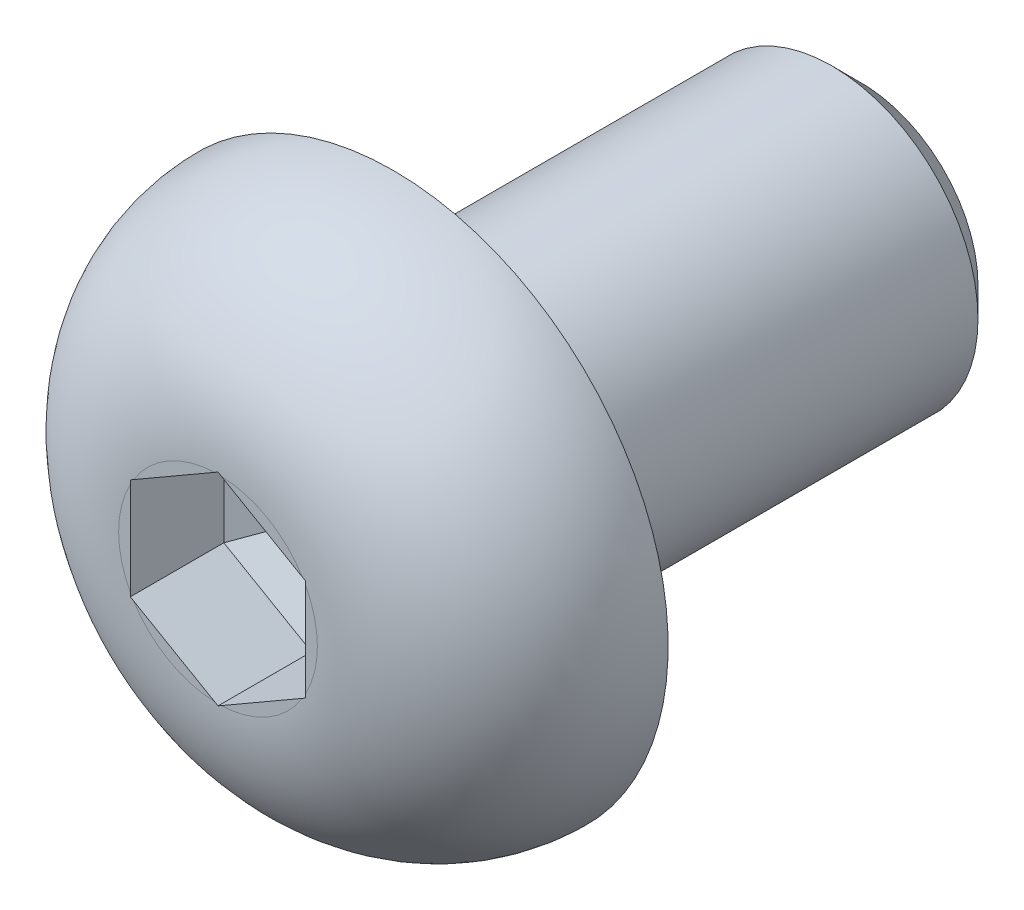
ISO-10303-21;
HEADER;
FILE_DESCRIPTION(('STEP AP214'),'2;1');
FILE_NAME('part.step','',(''),(''),'','','');
FILE_SCHEMA(('AUTOMOTIVE_DESIGN { 1 0 10303 214 1 1 1 1 }'));
ENDSEC;
DATA;
#1=APPLICATION_CONTEXT('core data for automotive mechanical design processes');
#2=APPLICATION_PROTOCOL_DEFINITION('international standard','automotive_design',2000,#1);
#3=PRODUCT_CONTEXT('',#1,'mechanical');
#4=PRODUCT('Part','Part','',(#3));
#5=PRODUCT_RELATED_PRODUCT_CATEGORY('part','',(#4));
#6=PRODUCT_DEFINITION_FORMATION('','',#4);
#7=PRODUCT_DEFINITION_CONTEXT('part definition',#1,'design');
#8=PRODUCT_DEFINITION('design','',#6,#7);
#9=PRODUCT_DEFINITION_SHAPE('','',#8);
#10=(LENGTH_UNIT() NAMED_UNIT(*) SI_UNIT(.MILLI.,.METRE.));
#11=(NAMED_UNIT(*) PLANE_ANGLE_UNIT() SI_UNIT($,.RADIAN.));
#12=(NAMED_UNIT(*) SI_UNIT($,.STERADIAN.) SOLID_ANGLE_UNIT());
#13=UNCERTAINTY_MEASURE_WITH_UNIT(LENGTH_MEASURE(1.E-05),#10,'distance_accuracy_value','');
#14=(GEOMETRIC_REPRESENTATION_CONTEXT(3) GLOBAL_UNCERTAINTY_ASSIGNED_CONTEXT((#13)) GLOBAL_UNIT_ASSIGNED_CONTEXT((#10,
#11,#12)) REPRESENTATION_CONTEXT('',''));
#15=CARTESIAN_POINT('',(0.,0.,0.));
#16=DIRECTION('',(0.,0.,1.));
#17=DIRECTION('',(1.,0.,0.));
#18=AXIS2_PLACEMENT_3D('',#15,#16,#17);
#19=CARTESIAN_POINT('',(0.,0.,2.));
#20=DIRECTION('',(0.,0.,1.));
#21=DIRECTION('',(1.,0.,0.));
#22=AXIS2_PLACEMENT_3D('',#19,#20,#21);
#23=PLANE('',#22);
#24=CARTESIAN_POINT('',(0.,0.,2.));
#25=DIRECTION('',(0.,0.,1.));
#26=DIRECTION('',(1.,0.,0.));
#27=AXIS2_PLACEMENT_3D('',#24,#25,#26);
#28=CIRCLE('',#27,1.00000019703);
#29=CARTESIAN_POINT('',(1.00000019703,0.,2.));
#30=VERTEX_POINT('',#29);
#31=EDGE_CURVE('E11',#30,#30,#28,.T.);
#32=ORIENTED_EDGE('',*,*,#31,.F.);
#33=EDGE_LOOP('',(#32));
#34=FACE_BOUND('',#33,.T.);
#35=ADVANCED_FACE('F17',(#34),#23,.F.);
#36=CARTESIAN_POINT('',(0.,0.,2.124999789005));
#37=DIRECTION('',(0.,0.,1.));
#38=DIRECTION('',(0.,-1.,0.));
#39=AXIS2_PLACEMENT_3D('',#36,#37,#38);
#40=CONICAL_SURFACE('',#39,1.125000010663,0.785398261912409);
#41=ORIENTED_EDGE('',*,*,#31,.T.);
#42=EDGE_LOOP('',(#41));
#43=FACE_BOUND('',#42,.T.);
#44=CARTESIAN_POINT('',(0.,0.,2.249999753713));
#45=DIRECTION('',(0.,0.,-1.));
#46=DIRECTION('',(1.,0.,0.));
#47=AXIS2_PLACEMENT_3D('',#44,#45,#46);
#48=CIRCLE('',#47,1.25);
#49=CARTESIAN_POINT('',(1.25,0.,2.249999753713));
#50=VERTEX_POINT('',#49);
#51=EDGE_CURVE('E315',#50,#50,#48,.T.);
#52=ORIENTED_EDGE('',*,*,#51,.T.);
#53=EDGE_LOOP('',(#52));
#54=FACE_BOUND('',#53,.T.);
#55=ADVANCED_FACE('F343',(#43,#54),#40,.T.);
#56=CARTESIAN_POINT('',(0.,0.,7.5));
#57=DIRECTION('',(0.,0.,-1.));
#58=DIRECTION('',(0.,-1.,0.));
#59=AXIS2_PLACEMENT_3D('',#56,#57,#58);
#60=PLANE('',#59);
#61=CARTESIAN_POINT('',(0.,0.,7.499999999987));
#62=DIRECTION('',(0.,0.,-1.));
#63=DIRECTION('',(0.848717837075013,-0.528845944515708,0.));
#64=AXIS2_PLACEMENT_3D('',#61,#62,#63);
#65=CIRCLE('',#64,0.8499937568999);
#66=CARTESIAN_POINT('',(0.7214095809729,-0.4495192983039,7.5));
#67=VERTEX_POINT('',#66);
#68=CARTESIAN_POINT('',(0.02859309510343,-0.8495197335029,7.5));
#69=VERTEX_POINT('',#68);
#70=EDGE_CURVE('E279',#67,#69,#65,.T.);
#71=ORIENTED_EDGE('',*,*,#70,.F.);
#72=DIRECTION('',(0.86602396910502,0.500002484929412,6.10625033893714E-13));
#73=VECTOR('',#72,1.);
#74=CARTESIAN_POINT('',(0.02859309510343,-0.8495197335029,7.5));
#75=LINE('',#74,#73);
#76=EDGE_CURVE('E269',#69,#67,#75,.T.);
#77=ORIENTED_EDGE('',*,*,#76,.F.);
#78=EDGE_LOOP('',(#71,#77));
#79=FACE_BOUND('',#78,.T.);
#80=ADVANCED_FACE('F412',(#79),#60,.F.);
#81=CARTESIAN_POINT('',(0.,0.,7.5));
#82=DIRECTION('',(0.,0.,-1.));
#83=DIRECTION('',(0.,-1.,0.));
#84=AXIS2_PLACEMENT_3D('',#81,#82,#83);
#85=PLANE('',#84);
#86=CARTESIAN_POINT('',(0.,0.,7.499999999987));
#87=DIRECTION('',(0.,0.,-1.));
#88=DIRECTION('',(-0.0336351041015099,-0.999434179809797,0.));
#89=AXIS2_PLACEMENT_3D('',#86,#87,#88);
#90=CIRCLE('',#89,0.8499937568997);
#91=CARTESIAN_POINT('',(-0.02859309510341,-0.849519733503,7.499999999999));
#92=VERTEX_POINT('',#91);
#93=CARTESIAN_POINT('',(-0.7214095809727,-0.4495192983038,7.5));
#94=VERTEX_POINT('',#93);
#95=EDGE_CURVE('E254',#92,#94,#90,.T.);
#96=ORIENTED_EDGE('',*,*,#95,.F.);
#97=DIRECTION('',(0.866023969104909,-0.500002484929605,-6.31719353246506E-13));
#98=VECTOR('',#97,1.);
#99=CARTESIAN_POINT('',(-0.7214095809727,-0.4495192983038,7.5));
#100=LINE('',#99,#98);
#101=EDGE_CURVE('E259',#94,#92,#100,.T.);
#102=ORIENTED_EDGE('',*,*,#101,.F.);
#103=EDGE_LOOP('',(#96,#102));
#104=FACE_BOUND('',#103,.T.);
#105=ADVANCED_FACE('F519',(#104),#85,.F.);
#106=CARTESIAN_POINT('',(0.,0.,7.5));
#107=DIRECTION('',(0.,0.,-1.));
#108=DIRECTION('',(0.,-1.,0.));
#109=AXIS2_PLACEMENT_3D('',#106,#107,#108);
#110=PLANE('',#109);
#111=CARTESIAN_POINT('',(0.,0.,7.499999999987));
#112=DIRECTION('',(0.,0.,-1.));
#113=DIRECTION('',(-0.848717837075013,0.528845944515708,0.));
#114=AXIS2_PLACEMENT_3D('',#111,#112,#113);
#115=CIRCLE('',#114,0.8499937568999);
#116=CARTESIAN_POINT('',(-0.721409580973,0.4495192983038,7.5));
#117=VERTEX_POINT('',#116);
#118=CARTESIAN_POINT('',(-0.02859309510337,0.8495197335029,7.5));
#119=VERTEX_POINT('',#118);
#120=EDGE_CURVE('E224',#117,#119,#115,.T.);
#121=ORIENTED_EDGE('',*,*,#120,.F.);
#122=DIRECTION('',(-0.86602396910502,-0.500002484929412,6.10625033893614E-13));
#123=VECTOR('',#122,1.);
#124=CARTESIAN_POINT('',(-0.02859309510337,0.8495197335029,7.5));
#125=LINE('',#124,#123);
#126=EDGE_CURVE('E217',#119,#117,#125,.T.);
#127=ORIENTED_EDGE('',*,*,#126,.F.);
#128=EDGE_LOOP('',(#121,#127));
#129=FACE_BOUND('',#128,.T.);
#130=ADVANCED_FACE('F491',(#129),#110,.F.);
#131=CARTESIAN_POINT('',(0.,0.,7.5));
#132=DIRECTION('',(0.,0.,-1.));
#133=DIRECTION('',(0.,-1.,0.));
#134=AXIS2_PLACEMENT_3D('',#131,#132,#133);
#135=PLANE('',#134);
#136=CARTESIAN_POINT('',(0.,0.,7.499999999995));
#137=DIRECTION('',(0.,0.,-1.));
#138=DIRECTION('',(0.882352941176484,0.470588235294092,0.));
#139=AXIS2_PLACEMENT_3D('',#136,#137,#138);
#140=CIRCLE('',#139,0.8500038733679);
#141=CARTESIAN_POINT('',(0.74999840261235,0.400005026801156,7.49999999999049));
#142=VERTEX_POINT('',#141);
#143=CARTESIAN_POINT('',(0.749998738069626,-0.400003325957899,7.49999999999138));
#144=VERTEX_POINT('',#143);
#145=EDGE_CURVE('E292',#142,#144,#140,.T.);
#146=ORIENTED_EDGE('',*,*,#145,.F.);
#147=DIRECTION('',(0.,-1.,0.));
#148=VECTOR('',#147,1.);
#149=CARTESIAN_POINT('',(0.7499968052247,0.39999806325,7.499999999986));
#150=LINE('',#149,#148);
#151=EDGE_CURVE('E93',#142,#144,#150,.T.);
#152=ORIENTED_EDGE('',*,*,#151,.T.);
#153=EDGE_LOOP('',(#146,#152));
#154=FACE_BOUND('',#153,.T.);
#155=ADVANCED_FACE('F484',(#154),#135,.F.);
#156=CARTESIAN_POINT('',(0.,0.,7.5));
#157=DIRECTION('',(0.,0.,-1.));
#158=DIRECTION('',(0.,-1.,0.));
#159=AXIS2_PLACEMENT_3D('',#156,#157,#158);
#160=PLANE('',#159);
#161=CARTESIAN_POINT('',(0.,0.,7.499999999995));
#162=DIRECTION('',(0.,0.,-1.));
#163=DIRECTION('',(-0.882352941176484,-0.470588235294092,0.));
#164=AXIS2_PLACEMENT_3D('',#161,#162,#163);
#165=CIRCLE('',#164,0.8500038733679);
#166=CARTESIAN_POINT('',(-0.74999840261235,-0.400005026801156,7.49999999999049));
#167=VERTEX_POINT('',#166);
#168=CARTESIAN_POINT('',(-0.749998738069626,0.400003325957899,7.49999999999138));
#169=VERTEX_POINT('',#168);
#170=EDGE_CURVE('E236',#167,#169,#165,.T.);
#171=ORIENTED_EDGE('',*,*,#170,.F.);
#172=DIRECTION('',(0.,1.,0.));
#173=VECTOR('',#172,1.);
#174=CARTESIAN_POINT('',(-0.7499968052247,-0.39999806325,7.499999999986));
#175=LINE('',#174,#173);
#176=EDGE_CURVE('E34',#167,#169,#175,.T.);
#177=ORIENTED_EDGE('',*,*,#176,.T.);
#178=EDGE_LOOP('',(#171,#177));
#179=FACE_BOUND('',#178,.T.);
#180=ADVANCED_FACE('F482',(#179),#160,.F.);
#181=CARTESIAN_POINT('',(-0.75,0.4330127018922,7.5));
#182=DIRECTION('',(-1.,0.,0.));
#183=DIRECTION('',(0.,0.,1.));
#184=AXIS2_PLACEMENT_3D('',#181,#182,#183);
#185=PLANE('',#184);
#186=DIRECTION('',(2.24992903633302E-06,-5.67352059675705E-07,0.999999999997308));
#187=VECTOR('',#186,1.);
#188=CARTESIAN_POINT('',(-0.75,0.4330127018922,6.7));
#189=LINE('',#188,#187);
#190=CARTESIAN_POINT('',(-0.75,0.4330127018922,6.7));
#191=VERTEX_POINT('',#190);
#192=CARTESIAN_POINT('',(-0.749998523448235,0.43301280791993,7.49991440612962));
#193=VERTEX_POINT('',#192);
#194=EDGE_CURVE('E220',#191,#193,#189,.T.);
#195=ORIENTED_EDGE('',*,*,#194,.T.);
#196=CARTESIAN_POINT('',(-0.75,0.433012247970175,7.49991439546112));
#197=CARTESIAN_POINT('',(-0.75,0.42750992025355,7.49994336110495));
#198=CARTESIAN_POINT('',(-0.75,0.422007573480964,7.49996497763848));
#199=CARTESIAN_POINT('',(-0.75,0.411002842395928,7.49999351248346));
#200=CARTESIAN_POINT('',(-0.75,0.405500458083482,7.50000043079644));
#201=CARTESIAN_POINT('',(-0.75,0.39999805471508,7.50000000000065));
#202=B_SPLINE_CURVE_WITH_KNOTS('',3,(#196,#197,#198,#199,#200,#201),.UNSPECIFIED.,.F.,.F.,(4,2,
4),(0.,0.0165071677014205,0.0330143336866557),.UNSPECIFIED.);
#203=EDGE_CURVE('E240',#193,#169,#202,.T.);
#204=ORIENTED_EDGE('',*,*,#203,.T.);
#205=ORIENTED_EDGE('',*,*,#176,.F.);
#206=CARTESIAN_POINT('',(-0.75,-0.4000018227614,7.50000000000199));
#207=CARTESIAN_POINT('',(-0.75,-0.405503598118224,7.50000042758911));
#208=CARTESIAN_POINT('',(-0.75,-0.411005354421076,7.49999350767165));
#209=CARTESIAN_POINT('',(-0.75,-0.422008829490639,7.49996497282612));
#210=CARTESIAN_POINT('',(-0.75,-0.427510548257345,7.49994335789651));
#211=CARTESIAN_POINT('',(-0.75,-0.433012247970075,7.4999143954608));
#212=B_SPLINE_CURVE_WITH_KNOTS('',3,(#206,#207,#208,#209,#210,#211),.UNSPECIFIED.,.F.,.F.,(4,2,
4),(0.,0.0165052819639968,0.0330105656434137),.UNSPECIFIED.);
#213=CARTESIAN_POINT('',(-0.749999423323558,-0.433012807875431,7.49991439780553));
#214=VERTEX_POINT('',#213);
#215=EDGE_CURVE('E241',#167,#214,#212,.T.);
#216=ORIENTED_EDGE('',*,*,#215,.T.);
#217=DIRECTION('',(2.24992919913702E-06,5.67352198329605E-07,0.999999999997308));
#218=VECTOR('',#217,1.);
#219=CARTESIAN_POINT('',(-0.75,-0.4330127018922,6.7));
#220=LINE('',#219,#218);
#221=CARTESIAN_POINT('',(-0.75,-0.4330127018922,6.7));
#222=VERTEX_POINT('',#221);
#223=EDGE_CURVE('E242',#222,#214,#220,.T.);
#224=ORIENTED_EDGE('',*,*,#223,.F.);
#225=DIRECTION('',(0.,1.,0.));
#226=VECTOR('',#225,1.);
#227=CARTESIAN_POINT('',(-0.75,-0.4330127018922,6.7));
#228=LINE('',#227,#226);
#229=EDGE_CURVE('E215',#222,#191,#228,.T.);
#230=ORIENTED_EDGE('',*,*,#229,.T.);
#231=EDGE_LOOP('',(#195,#204,#205,#216,#224,#230));
#232=FACE_BOUND('',#231,.T.);
#233=ADVANCED_FACE('F476',(#232),#185,.F.);
#234=CARTESIAN_POINT('',(-0.3966506350946,0.,6.5));
#235=DIRECTION('',(-0.492581293369386,0.,-0.870266435881876));
#236=DIRECTION('',(-0.870266435881876,0.,0.492581293369386));
#237=AXIS2_PLACEMENT_3D('',#234,#235,#236);
#238=PLANE('',#237);
#239=DIRECTION('',(0.777626846502185,0.448963069157091,-0.440146169053091));
#240=VECTOR('',#239,1.);
#241=CARTESIAN_POINT('',(-0.75,-0.4330127018922,6.7));
#242=LINE('',#241,#240);
#243=CARTESIAN_POINT('',(-0.04330127018922,-0.025,6.3));
#244=VERTEX_POINT('',#243);
#245=EDGE_CURVE('E561',#222,#244,#242,.T.);
#246=ORIENTED_EDGE('',*,*,#245,.T.);
#247=DIRECTION('',(0.,1.,0.));
#248=VECTOR('',#247,1.);
#249=CARTESIAN_POINT('',(-0.04330127018922,-0.025,6.3));
#250=LINE('',#249,#248);
#251=CARTESIAN_POINT('',(-0.04330127018922,0.025,6.3));
#252=VERTEX_POINT('',#251);
#253=EDGE_CURVE('E168',#244,#252,#250,.T.);
#254=ORIENTED_EDGE('',*,*,#253,.T.);
#255=DIRECTION('',(0.777626846502185,-0.448963069157091,-0.440146169053091));
#256=VECTOR('',#255,1.);
#257=CARTESIAN_POINT('',(-0.75,0.4330127018922,6.7));
#258=LINE('',#257,#256);
#259=EDGE_CURVE('E197',#191,#252,#258,.T.);
#260=ORIENTED_EDGE('',*,*,#259,.F.);
#261=ORIENTED_EDGE('',*,*,#229,.F.);
#262=EDGE_LOOP('',(#246,#254,#260,#261));
#263=FACE_BOUND('',#262,.T.);
#264=ADVANCED_FACE('F490',(#263),#238,.F.);
#265=CARTESIAN_POINT('',(0.,0.,6.3));
#266=DIRECTION('',(0.,0.,1.));
#267=DIRECTION('',(1.,0.,0.));
#268=AXIS2_PLACEMENT_3D('',#265,#266,#267);
#269=PLANE('',#268);
#270=DIRECTION('',(0.,-1.,0.));
#271=VECTOR('',#270,1.);
#272=CARTESIAN_POINT('',(0.04330127018922,0.025,6.3));
#273=LINE('',#272,#271);
#274=CARTESIAN_POINT('',(0.04330127018922,0.025,6.3));
#275=VERTEX_POINT('',#274);
#276=CARTESIAN_POINT('',(0.04330127018922,-0.025,6.3));
#277=VERTEX_POINT('',#276);
#278=EDGE_CURVE('E181',#275,#277,#273,.T.);
#279=ORIENTED_EDGE('',*,*,#278,.F.);
#280=DIRECTION('',(0.866025403784429,-0.500000000000017,1.06581410364004E-13));
#281=VECTOR('',#280,1.);
#282=CARTESIAN_POINT('',(0.,0.05,6.3));
#283=LINE('',#282,#281);
#284=CARTESIAN_POINT('',(0.,0.05,6.3));
#285=VERTEX_POINT('',#284);
#286=EDGE_CURVE('E174',#285,#275,#283,.T.);
#287=ORIENTED_EDGE('',*,*,#286,.F.);
#288=DIRECTION('',(0.866025403784429,0.500000000000017,-1.06581410364004E-13));
#289=VECTOR('',#288,1.);
#290=CARTESIAN_POINT('',(-0.04330127018922,0.025,6.3));
#291=LINE('',#290,#289);
#292=EDGE_CURVE('E178',#252,#285,#291,.T.);
#293=ORIENTED_EDGE('',*,*,#292,.F.);
#294=ORIENTED_EDGE('',*,*,#253,.F.);
#295=DIRECTION('',(-0.866025403784429,0.500000000000017,1.06581410364004E-13));
#296=VECTOR('',#295,1.);
#297=CARTESIAN_POINT('',(0.,-0.05,6.3));
#298=LINE('',#297,#296);
#299=CARTESIAN_POINT('',(0.,-0.05,6.3));
#300=VERTEX_POINT('',#299);
#301=EDGE_CURVE('E557',#300,#244,#298,.T.);
#302=ORIENTED_EDGE('',*,*,#301,.F.);
#303=DIRECTION('',(-0.866025403784429,-0.500000000000017,-1.06581410364004E-13));
#304=VECTOR('',#303,1.);
#305=CARTESIAN_POINT('',(0.04330127018922,-0.025,6.3));
#306=LINE('',#305,#304);
#307=EDGE_CURVE('E547',#277,#300,#306,.T.);
#308=ORIENTED_EDGE('',*,*,#307,.F.);
#309=EDGE_LOOP('',(#279,#287,#293,#294,#302,#308));
#310=FACE_BOUND('',#309,.T.);
#311=ADVANCED_FACE('F176',(#310),#269,.T.);
#312=CARTESIAN_POINT('',(0.3966506350946,0.,6.5));
#313=DIRECTION('',(0.492581293369386,0.,-0.870266435881876));
#314=DIRECTION('',(0.,-1.,0.));
#315=AXIS2_PLACEMENT_3D('',#312,#313,#314);
#316=PLANE('',#315);
#317=DIRECTION('',(-0.777626846502185,-0.448963069157091,-0.440146169053091));
#318=VECTOR('',#317,1.);
#319=CARTESIAN_POINT('',(0.75,0.4330127018922,6.7));
#320=LINE('',#319,#318);
#321=CARTESIAN_POINT('',(0.75,0.4330127018922,6.7));
#322=VERTEX_POINT('',#321);
#323=EDGE_CURVE('E185',#322,#275,#320,.T.);
#324=ORIENTED_EDGE('',*,*,#323,.T.);
#325=ORIENTED_EDGE('',*,*,#278,.T.);
#326=DIRECTION('',(-0.777626846502185,0.448963069157091,-0.440146169053091));
#327=VECTOR('',#326,1.);
#328=CARTESIAN_POINT('',(0.75,-0.4330127018922,6.7));
#329=LINE('',#328,#327);
#330=CARTESIAN_POINT('',(0.75,-0.4330127018922,6.7));
#331=VERTEX_POINT('',#330);
#332=EDGE_CURVE('E543',#331,#277,#329,.T.);
#333=ORIENTED_EDGE('',*,*,#332,.F.);
#334=DIRECTION('',(0.,-1.,0.));
#335=VECTOR('',#334,1.);
#336=CARTESIAN_POINT('',(0.75,0.4330127018922,6.7));
#337=LINE('',#336,#335);
#338=EDGE_CURVE('E48',#322,#331,#337,.T.);
#339=ORIENTED_EDGE('',*,*,#338,.F.);
#340=EDGE_LOOP('',(#324,#325,#333,#339));
#341=FACE_BOUND('',#340,.T.);
#342=ADVANCED_FACE('F505',(#341),#316,.F.);
#343=CARTESIAN_POINT('',(0.75,-0.4330127018922,7.5));
#344=DIRECTION('',(1.,0.,0.));
#345=DIRECTION('',(0.,1.,0.));
#346=AXIS2_PLACEMENT_3D('',#343,#344,#345);
#347=PLANE('',#346);
#348=DIRECTION('',(-2.24992903647101E-06,5.67352059606305E-07,0.999999999997308));
#349=VECTOR('',#348,1.);
#350=CARTESIAN_POINT('',(0.75,-0.4330127018922,6.7));
#351=LINE('',#350,#349);
#352=CARTESIAN_POINT('',(0.749998523448235,-0.433012807919931,7.49991440612962));
#353=VERTEX_POINT('',#352);
#354=EDGE_CURVE('E276',#331,#353,#351,.T.);
#355=ORIENTED_EDGE('',*,*,#354,.T.);
#356=CARTESIAN_POINT('',(0.75,-0.433012247970175,7.49991439546112));
#357=CARTESIAN_POINT('',(0.75,-0.42750992025355,7.49994336110495));
#358=CARTESIAN_POINT('',(0.75,-0.422007573480964,7.49996497763848));
#359=CARTESIAN_POINT('',(0.75,-0.411002842395928,7.49999351248346));
#360=CARTESIAN_POINT('',(0.75,-0.405500458083482,7.50000043079644));
#361=CARTESIAN_POINT('',(0.75,-0.39999805471508,7.50000000000065));
#362=B_SPLINE_CURVE_WITH_KNOTS('',3,(#356,#357,#358,#359,#360,#361),.UNSPECIFIED.,.F.,.F.,(4,2,
4),(0.,0.0165071677014205,0.0330143336866557),.UNSPECIFIED.);
#363=EDGE_CURVE('E296',#353,#144,#362,.T.);
#364=ORIENTED_EDGE('',*,*,#363,.T.);
#365=ORIENTED_EDGE('',*,*,#151,.F.);
#366=CARTESIAN_POINT('',(0.75,0.4000018227614,7.50000000000199));
#367=CARTESIAN_POINT('',(0.75,0.405503598118224,7.50000042758911));
#368=CARTESIAN_POINT('',(0.75,0.411005354421076,7.49999350767165));
#369=CARTESIAN_POINT('',(0.75,0.422008829490639,7.49996497282612));
#370=CARTESIAN_POINT('',(0.75,0.427510548257345,7.49994335789651));
#371=CARTESIAN_POINT('',(0.75,0.433012247970075,7.4999143954608));
#372=B_SPLINE_CURVE_WITH_KNOTS('',3,(#366,#367,#368,#369,#370,#371),.UNSPECIFIED.,.F.,.F.,(4,2,
4),(0.,0.0165052819639968,0.0330105656434137),.UNSPECIFIED.);
#373=CARTESIAN_POINT('',(0.749999100124604,0.433012248014533,7.4999144037849));
#374=VERTEX_POINT('',#373);
#375=EDGE_CURVE('E297',#142,#374,#372,.T.);
#376=ORIENTED_EDGE('',*,*,#375,.T.);
#377=DIRECTION('',(-2.24992919913702E-06,-5.67352198329605E-07,0.999999999997308));
#378=VECTOR('',#377,1.);
#379=CARTESIAN_POINT('',(0.75,0.4330127018922,6.7));
#380=LINE('',#379,#378);
#381=EDGE_CURVE('E104',#322,#374,#380,.T.);
#382=ORIENTED_EDGE('',*,*,#381,.F.);
#383=ORIENTED_EDGE('',*,*,#338,.T.);
#384=EDGE_LOOP('',(#355,#364,#365,#376,#382,#383));
#385=FACE_BOUND('',#384,.T.);
#386=ADVANCED_FACE('F504',(#385),#347,.F.);
#387=CARTESIAN_POINT('',(0.,0.,7.5));
#388=DIRECTION('',(0.,0.,-1.));
#389=DIRECTION('',(0.,-1.,0.));
#390=AXIS2_PLACEMENT_3D('',#387,#388,#389);
#391=PLANE('',#390);
#392=CARTESIAN_POINT('',(0.,0.,7.499999999987));
#393=DIRECTION('',(0.,0.,-1.));
#394=DIRECTION('',(0.0336351041015299,0.999434179809796,0.));
#395=AXIS2_PLACEMENT_3D('',#392,#393,#394);
#396=CIRCLE('',#395,0.8499937568997);
#397=CARTESIAN_POINT('',(0.028589628499,0.8495128132705,7.499999999987));
#398=VERTEX_POINT('',#397);
#399=CARTESIAN_POINT('',(0.7214095809727,0.4495192983038,7.5));
#400=VERTEX_POINT('',#399);
#401=EDGE_CURVE('E304',#398,#400,#396,.T.);
#402=ORIENTED_EDGE('',*,*,#401,.F.);
#403=DIRECTION('',(-0.866023969104909,0.500002484929605,-6.31719353246706E-13));
#404=VECTOR('',#403,1.);
#405=CARTESIAN_POINT('',(0.7214095809727,0.4495192983038,7.5));
#406=LINE('',#405,#404);
#407=EDGE_CURVE('E114',#400,#398,#406,.T.);
#408=ORIENTED_EDGE('',*,*,#407,.F.);
#409=EDGE_LOOP('',(#402,#408));
#410=FACE_BOUND('',#409,.T.);
#411=ADVANCED_FACE('F422',(#410),#391,.F.);
#412=CARTESIAN_POINT('',(0.75,0.4330127018922,7.5));
#413=DIRECTION('',(0.500000000000017,0.866025403784429,0.));
#414=DIRECTION('',(0.,0.,-1.));
#415=AXIS2_PLACEMENT_3D('',#412,#413,#414);
#416=PLANE('',#415);
#417=ORIENTED_EDGE('',*,*,#381,.T.);
#418=CARTESIAN_POINT('',(0.749998846647121,0.433013367780795,7.49991440015043));
#419=CARTESIAN_POINT('',(0.745234008263265,0.435764348504359,7.49994336307334));
#420=CARTESIAN_POINT('',(0.740469153378446,0.43851533875476,7.49996497785566));
#421=CARTESIAN_POINT('',(0.730939411102167,0.444017338023277,7.49999351113762));
#422=CARTESIAN_POINT('',(0.72617452371071,0.446768347041393,7.5000004296388));
#423=CARTESIAN_POINT('',(0.721409619818294,0.449519365586343,7.50000000000091));
#424=B_SPLINE_CURVE_WITH_KNOTS('',3,(#418,#419,#420,#421,#422,#423),.UNSPECIFIED.,.F.,.F.,(4,2,
4),(0.,0.0165060688739016,0.0330121360320727),.UNSPECIFIED.);
#425=EDGE_CURVE('E308',#374,#400,#424,.T.);
#426=ORIENTED_EDGE('',*,*,#425,.T.);
#427=ORIENTED_EDGE('',*,*,#407,.T.);
#428=CARTESIAN_POINT('',(0.0285923828079302,0.849517583873507,7.5000000000003));
#429=CARTESIAN_POINT('',(0.02382676206383,0.852269016292969,7.50000043171068));
#430=CARTESIAN_POINT('',(0.0190611578259205,0.855020439182577,7.4999935130643));
#431=CARTESIAN_POINT('',(0.00952998186689764,0.860523266188213,7.49996497505652));
#432=CARTESIAN_POINT('',(0.00476441014578776,0.863274670304238,7.49994335569359));
#433=CARTESIAN_POINT('',(-1.14506912798834E-06,0.866026064890408,7.49991438597236));
#434=B_SPLINE_CURVE_WITH_KNOTS('',3,(#428,#429,#430,#431,#432,#433),.UNSPECIFIED.,.F.,.F.,(4,2,
4),(0.,0.016508550385712,0.0330171024881889),.UNSPECIFIED.);
#435=CARTESIAN_POINT('',(-6.913715993579E-11,0.8660280478621,7.49991436478));
#436=VERTEX_POINT('',#435);
#437=EDGE_CURVE('E309',#398,#436,#434,.T.);
#438=ORIENTED_EDGE('',*,*,#437,.T.);
#439=DIRECTION('',(-8.64359124378132E-11,3.30545092836713E-06,0.999999999994537));
#440=VECTOR('',#439,1.);
#441=CARTESIAN_POINT('',(0.,0.8660254037844,6.7));
#442=LINE('',#441,#440);
#443=CARTESIAN_POINT('',(0.,0.8660254037844,6.7));
#444=VERTEX_POINT('',#443);
#445=EDGE_CURVE('E221',#444,#436,#442,.T.);
#446=ORIENTED_EDGE('',*,*,#445,.F.);
#447=DIRECTION('',(0.866025403784429,-0.500000000000017,0.));
#448=VECTOR('',#447,1.);
#449=CARTESIAN_POINT('',(0.,0.8660254037844,6.7));
#450=LINE('',#449,#448);
#451=EDGE_CURVE('E190',#444,#322,#450,.T.);
#452=ORIENTED_EDGE('',*,*,#451,.T.);
#453=EDGE_LOOP('',(#417,#426,#427,#438,#446,#452));
#454=FACE_BOUND('',#453,.T.);
#455=ADVANCED_FACE('F418',(#454),#416,.F.);
#456=CARTESIAN_POINT('',(0.1983253175473,0.3435095264192,6.5));
#457=DIRECTION('',(0.246290646684714,0.426587913486924,-0.87026643588185));
#458=DIRECTION('',(-0.962209283245216,0.,-0.272311026652846));
#459=AXIS2_PLACEMENT_3D('',#456,#457,#458);
#460=PLANE('',#459);
#461=DIRECTION('',(0.,-0.897926138314213,-0.440146169053106));
#462=VECTOR('',#461,1.);
#463=CARTESIAN_POINT('',(0.,0.8660254037844,6.7));
#464=LINE('',#463,#462);
#465=EDGE_CURVE('E186',#444,#285,#464,.T.);
#466=ORIENTED_EDGE('',*,*,#465,.T.);
#467=ORIENTED_EDGE('',*,*,#286,.T.);
#468=ORIENTED_EDGE('',*,*,#323,.F.);
#469=ORIENTED_EDGE('',*,*,#451,.F.);
#470=EDGE_LOOP('',(#466,#467,#468,#469));
#471=FACE_BOUND('',#470,.T.);
#472=ADVANCED_FACE('F189',(#471),#460,.F.);
#473=CARTESIAN_POINT('',(-0.1983253175473,0.3435095264192,6.5));
#474=DIRECTION('',(-0.246290646684714,0.426587913486924,-0.87026643588185));
#475=DIRECTION('',(-0.962209283245216,0.,0.272311026652846));
#476=AXIS2_PLACEMENT_3D('',#473,#474,#475);
#477=PLANE('',#476);
#478=ORIENTED_EDGE('',*,*,#259,.T.);
#479=ORIENTED_EDGE('',*,*,#292,.T.);
#480=ORIENTED_EDGE('',*,*,#465,.F.);
#481=DIRECTION('',(0.866025403784429,0.500000000000017,0.));
#482=VECTOR('',#481,1.);
#483=CARTESIAN_POINT('',(-0.75,0.4330127018922,6.7));
#484=LINE('',#483,#482);
#485=EDGE_CURVE('E202',#191,#444,#484,.T.);
#486=ORIENTED_EDGE('',*,*,#485,.F.);
#487=EDGE_LOOP('',(#478,#479,#480,#486));
#488=FACE_BOUND('',#487,.T.);
#489=ADVANCED_FACE('F196',(#488),#477,.F.);
#490=CARTESIAN_POINT('',(0.,0.8660254037844,7.5));
#491=DIRECTION('',(-0.500000000000017,0.866025403784429,0.));
#492=DIRECTION('',(0.,0.,1.));
#493=AXIS2_PLACEMENT_3D('',#490,#491,#492);
#494=PLANE('',#493);
#495=ORIENTED_EDGE('',*,*,#445,.T.);
#496=CARTESIAN_POINT('',(1.14496544194069E-06,0.866026064830506,7.49991438597353));
#497=CARTESIAN_POINT('',(-0.00476434413338689,0.863274708416477,7.49994335530435));
#498=CARTESIAN_POINT('',(-0.00952984973820052,0.860523342472713,7.499964974472));
#499=CARTESIAN_POINT('',(-0.0190608934642393,0.855020591811826,7.49999351247945));
#500=CARTESIAN_POINT('',(-0.0238264315854611,0.852269207094705,7.50000043132078));
#501=CARTESIAN_POINT('',(-0.0285919862126642,0.849517812847852,7.50000000000045));
#502=B_SPLINE_CURVE_WITH_KNOTS('',3,(#496,#497,#498,#499,#500,#501),.UNSPECIFIED.,.F.,.F.,(4,2,
4),(0.,0.0165083230683741,0.0330166444200775),.UNSPECIFIED.);
#503=EDGE_CURVE('E228',#436,#119,#502,.T.);
#504=ORIENTED_EDGE('',*,*,#503,.T.);
#505=ORIENTED_EDGE('',*,*,#126,.T.);
#506=CARTESIAN_POINT('',(-0.721409619818502,0.449519365586183,7.5000000000009));
#507=CARTESIAN_POINT('',(-0.726174523710887,0.446768347041252,7.50000042963881));
#508=CARTESIAN_POINT('',(-0.730939411102311,0.444017338023155,7.49999351113764));
#509=CARTESIAN_POINT('',(-0.740469153378525,0.438515338754675,7.49996497785562));
#510=CARTESIAN_POINT('',(-0.745234008263313,0.435764348504293,7.49994336307324));
#511=CARTESIAN_POINT('',(-0.749998846647136,0.433013367780748,7.49991440015024));
#512=B_SPLINE_CURVE_WITH_KNOTS('',3,(#506,#507,#508,#509,#510,#511),.UNSPECIFIED.,.F.,.F.,(4,2,
4),(0.,0.0165060671580596,0.0330121360318501),.UNSPECIFIED.);
#513=EDGE_CURVE('E251',#117,#193,#512,.T.);
#514=ORIENTED_EDGE('',*,*,#513,.T.);
#515=ORIENTED_EDGE('',*,*,#194,.F.);
#516=ORIENTED_EDGE('',*,*,#485,.T.);
#517=EDGE_LOOP('',(#495,#504,#505,#514,#515,#516));
#518=FACE_BOUND('',#517,.T.);
#519=ADVANCED_FACE('F334',(#518),#494,.F.);
#520=CARTESIAN_POINT('',(-0.75,-0.4330127018922,7.5));
#521=DIRECTION('',(-0.500000000000017,-0.866025403784429,0.));
#522=DIRECTION('',(-0.866025403784429,0.500000000000017,0.));
#523=AXIS2_PLACEMENT_3D('',#520,#521,#522);
#524=PLANE('',#523);
#525=ORIENTED_EDGE('',*,*,#223,.T.);
#526=CARTESIAN_POINT('',(-0.749998846647121,-0.433013367780795,7.49991440015043));
#527=CARTESIAN_POINT('',(-0.745234008263265,-0.435764348504359,7.49994336307334));
#528=CARTESIAN_POINT('',(-0.740469153378446,-0.43851533875476,7.49996497785566));
#529=CARTESIAN_POINT('',(-0.730939411102167,-0.444017338023277,7.49999351113762));
#530=CARTESIAN_POINT('',(-0.72617452371071,-0.446768347041393,7.5000004296388));
#531=CARTESIAN_POINT('',(-0.721409619818294,-0.449519365586343,7.50000000000091));
#532=B_SPLINE_CURVE_WITH_KNOTS('',3,(#526,#527,#528,#529,#530,#531),.UNSPECIFIED.,.F.,.F.,(4,2,
4),(0.,0.0165060688739016,0.0330121360320727),.UNSPECIFIED.);
#533=EDGE_CURVE('E246',#214,#94,#532,.T.);
#534=ORIENTED_EDGE('',*,*,#533,.T.);
#535=ORIENTED_EDGE('',*,*,#101,.T.);
#536=CARTESIAN_POINT('',(-0.0285919862126651,-0.84951781284789,7.50000000000103));
#537=CARTESIAN_POINT('',(-0.0238252672641823,-0.852269879315948,7.50000043163591));
#538=CARTESIAN_POINT('',(-0.0190585648343779,-0.855021936246942,7.49999350936014));
#539=CARTESIAN_POINT('',(-0.00952519251607328,-0.860526031321201,7.4999649569858));
#540=CARTESIAN_POINT('',(-0.0047585226275765,-0.863278069464463,7.4999433268857));
#541=CARTESIAN_POINT('',(8.13074223842222E-06,-0.866030098070659,7.49991434287341));
#542=B_SPLINE_CURVE_WITH_KNOTS('',3,(#536,#537,#538,#539,#540,#541),.UNSPECIFIED.,.F.,.F.,(4,2,
4),(0.,0.0165123546447126,0.0330247110078094),.UNSPECIFIED.);
#543=CARTESIAN_POINT('',(7.787853057944E-06,-0.8660306919043,7.499914336526));
#544=VERTEX_POINT('',#543);
#545=EDGE_CURVE('E229',#92,#544,#542,.T.);
#546=ORIENTED_EDGE('',*,*,#545,.T.);
#547=DIRECTION('',(8.64359470954432E-11,-3.30545092836713E-06,0.999999999994537));
#548=VECTOR('',#547,1.);
#549=CARTESIAN_POINT('',(0.,-0.8660254037844,6.7));
#550=LINE('',#549,#548);
#551=CARTESIAN_POINT('',(0.,-0.8660254037844,6.7));
#552=VERTEX_POINT('',#551);
#553=EDGE_CURVE('E265',#552,#544,#550,.T.);
#554=ORIENTED_EDGE('',*,*,#553,.F.);
#555=DIRECTION('',(-0.866025403784429,0.500000000000017,0.));
#556=VECTOR('',#555,1.);
#557=CARTESIAN_POINT('',(0.,-0.8660254037844,6.7));
#558=LINE('',#557,#556);
#559=EDGE_CURVE('E247',#552,#222,#558,.T.);
#560=ORIENTED_EDGE('',*,*,#559,.T.);
#561=EDGE_LOOP('',(#525,#534,#535,#546,#554,#560));
#562=FACE_BOUND('',#561,.T.);
#563=ADVANCED_FACE('F339',(#562),#524,.F.);
#564=CARTESIAN_POINT('',(-0.1983253175473,-0.3435095264192,6.5));
#565=DIRECTION('',(-0.246290646684714,-0.426587913486924,-0.87026643588185));
#566=DIRECTION('',(0.,-0.897926138314242,0.440146169053045));
#567=AXIS2_PLACEMENT_3D('',#564,#565,#566);
#568=PLANE('',#567);
#569=DIRECTION('',(0.,0.897926138314213,-0.440146169053106));
#570=VECTOR('',#569,1.);
#571=CARTESIAN_POINT('',(0.,-0.8660254037844,6.7));
#572=LINE('',#571,#570);
#573=EDGE_CURVE('E554',#552,#300,#572,.T.);
#574=ORIENTED_EDGE('',*,*,#573,.T.);
#575=ORIENTED_EDGE('',*,*,#301,.T.);
#576=ORIENTED_EDGE('',*,*,#245,.F.);
#577=ORIENTED_EDGE('',*,*,#559,.F.);
#578=EDGE_LOOP('',(#574,#575,#576,#577));
#579=FACE_BOUND('',#578,.T.);
#580=ADVANCED_FACE('F394',(#579),#568,.F.);
#581=CARTESIAN_POINT('',(0.1983253175473,-0.3435095264192,6.5));
#582=DIRECTION('',(0.246290646684714,-0.426587913486924,-0.87026643588185));
#583=DIRECTION('',(0.,-0.897926138314242,0.440146169053045));
#584=AXIS2_PLACEMENT_3D('',#581,#582,#583);
#585=PLANE('',#584);
#586=ORIENTED_EDGE('',*,*,#332,.T.);
#587=ORIENTED_EDGE('',*,*,#307,.T.);
#588=ORIENTED_EDGE('',*,*,#573,.F.);
#589=DIRECTION('',(-0.866025403784429,-0.500000000000017,0.));
#590=VECTOR('',#589,1.);
#591=CARTESIAN_POINT('',(0.75,-0.4330127018922,6.7));
#592=LINE('',#591,#590);
#593=EDGE_CURVE('E289',#331,#552,#592,.T.);
#594=ORIENTED_EDGE('',*,*,#593,.F.);
#595=EDGE_LOOP('',(#586,#587,#588,#594));
#596=FACE_BOUND('',#595,.T.);
#597=ADVANCED_FACE('F391',(#596),#585,.F.);
#598=CARTESIAN_POINT('',(0.,-0.8660254037844,7.5));
#599=DIRECTION('',(0.500000000000017,-0.866025403784429,0.));
#600=DIRECTION('',(0.,0.,-1.));
#601=AXIS2_PLACEMENT_3D('',#598,#599,#600);
#602=PLANE('',#601);
#603=ORIENTED_EDGE('',*,*,#553,.T.);
#604=CARTESIAN_POINT('',(3.55070383271325E-06,-0.866023353784586,7.49991441493704));
#605=CARTESIAN_POINT('',(0.00476825720801815,-0.863272449201785,7.49994337440198));
#606=CARTESIAN_POINT('',(0.00953298020965801,-0.860521535094174,7.49996498622305));
#607=CARTESIAN_POINT('',(0.0190624587126203,-0.855019688115252,7.49999351457599));
#608=CARTESIAN_POINT('',(0.0238272142139392,-0.852268755243943,7.50000043110939));
#609=CARTESIAN_POINT('',(0.0285919862127092,-0.849517812847826,7.50000000000045));
#610=B_SPLINE_CURVE_WITH_KNOTS('',3,(#604,#605,#606,#607,#608,#609),.UNSPECIFIED.,.F.,.F.,(4,2,
4),(0.,0.0165056119857934,0.0330112222560653),.UNSPECIFIED.);
#611=EDGE_CURVE('E283',#544,#69,#610,.T.);
#612=ORIENTED_EDGE('',*,*,#611,.T.);
#613=ORIENTED_EDGE('',*,*,#76,.T.);
#614=CARTESIAN_POINT('',(0.721409619818384,-0.449519365586252,7.5000000000009));
#615=CARTESIAN_POINT('',(0.726174523710788,-0.446768347041309,7.50000042963881));
#616=CARTESIAN_POINT('',(0.730939411102232,-0.444017338023201,7.49999351113764));
#617=CARTESIAN_POINT('',(0.740469153378486,-0.438515338754697,7.49996497785562));
#618=CARTESIAN_POINT('',(0.745234008263293,-0.435764348504305,7.49994336307324));
#619=CARTESIAN_POINT('',(0.749998846647136,-0.433013367780748,7.49991440015024));
#620=B_SPLINE_CURVE_WITH_KNOTS('',3,(#614,#615,#616,#617,#618,#619),.UNSPECIFIED.,.F.,.F.,(4,2,
4),(0.,0.0165060671581279,0.0330121360319867),.UNSPECIFIED.);
#621=EDGE_CURVE('E270',#67,#353,#620,.T.);
#622=ORIENTED_EDGE('',*,*,#621,.T.);
#623=ORIENTED_EDGE('',*,*,#354,.F.);
#624=ORIENTED_EDGE('',*,*,#593,.T.);
#625=EDGE_LOOP('',(#603,#612,#613,#622,#623,#624));
#626=FACE_BOUND('',#625,.T.);
#627=ADVANCED_FACE('F387',(#626),#602,.F.);
#628=CARTESIAN_POINT('',(0.,0.,5.99999999999932));
#629=DIRECTION('',(0.,0.,-1.));
#630=DIRECTION('',(0.,1.,0.));
#631=AXIS2_PLACEMENT_3D('',#628,#629,#630);
#632=DEGENERATE_TOROIDAL_SURFACE('',#631,0.849999999998394,1.5000000000016,.T.);
#633=ORIENTED_EDGE('',*,*,#611,.F.);
#634=ORIENTED_EDGE('',*,*,#545,.F.);
#635=ORIENTED_EDGE('',*,*,#95,.T.);
#636=ORIENTED_EDGE('',*,*,#533,.F.);
#637=ORIENTED_EDGE('',*,*,#215,.F.);
#638=ORIENTED_EDGE('',*,*,#170,.T.);
#639=ORIENTED_EDGE('',*,*,#203,.F.);
#640=ORIENTED_EDGE('',*,*,#513,.F.);
#641=ORIENTED_EDGE('',*,*,#120,.T.);
#642=ORIENTED_EDGE('',*,*,#503,.F.);
#643=ORIENTED_EDGE('',*,*,#437,.F.);
#644=ORIENTED_EDGE('',*,*,#401,.T.);
#645=ORIENTED_EDGE('',*,*,#425,.F.);
#646=ORIENTED_EDGE('',*,*,#375,.F.);
#647=ORIENTED_EDGE('',*,*,#145,.T.);
#648=ORIENTED_EDGE('',*,*,#363,.F.);
#649=ORIENTED_EDGE('',*,*,#621,.F.);
#650=ORIENTED_EDGE('',*,*,#70,.T.);
#651=EDGE_LOOP('',(#633,#634,#635,#636,#637,#638,#639,#640,#641,#642,#643,#644,#645,#646,#647,
#648,#649,#650));
#652=FACE_BOUND('',#651,.T.);
#653=CARTESIAN_POINT('',(0.,1.03263435393E-13,6.));
#654=DIRECTION('',(0.,0.,1.));
#655=DIRECTION('',(0.,1.,0.));
#656=AXIS2_PLACEMENT_3D('',#653,#654,#655);
#657=CIRCLE('',#656,2.35);
#658=CARTESIAN_POINT('',(0.,2.3500000000001,6.00000000000015));
#659=VERTEX_POINT('',#658);
#660=EDGE_CURVE('E284',#659,#659,#657,.T.);
#661=ORIENTED_EDGE('',*,*,#660,.T.);
#662=EDGE_LOOP('',(#661));
#663=FACE_BOUND('',#662,.T.);
#664=ADVANCED_FACE('F19',(#652,#663),#632,.T.);
#665=CARTESIAN_POINT('',(0.,0.,6.));
#666=DIRECTION('',(0.,0.,-1.));
#667=DIRECTION('',(0.,-1.,0.));
#668=AXIS2_PLACEMENT_3D('',#665,#666,#667);
#669=PLANE('',#668);
#670=CARTESIAN_POINT('',(0.,0.,6.));
#671=DIRECTION('',(0.,0.,-1.));
#672=DIRECTION('',(1.,0.,0.));
#673=AXIS2_PLACEMENT_3D('',#670,#671,#672);
#674=CIRCLE('',#673,1.25);
#675=CARTESIAN_POINT('',(1.25,0.,6.));
#676=VERTEX_POINT('',#675);
#677=EDGE_CURVE('E539',#676,#676,#674,.T.);
#678=ORIENTED_EDGE('',*,*,#677,.F.);
#679=EDGE_LOOP('',(#678));
#680=FACE_BOUND('',#679,.T.);
#681=ORIENTED_EDGE('',*,*,#660,.F.);
#682=EDGE_LOOP('',(#681));
#683=FACE_BOUND('',#682,.T.);
#684=ADVANCED_FACE('F494',(#680,#683),#669,.T.);
#685=CARTESIAN_POINT('',(0.,0.,0.));
#686=DIRECTION('',(0.,0.,1.));
#687=DIRECTION('',(1.,0.,0.));
#688=AXIS2_PLACEMENT_3D('',#685,#686,#687);
#689=CYLINDRICAL_SURFACE('',#688,1.25);
#690=ORIENTED_EDGE('',*,*,#51,.F.);
#691=EDGE_LOOP('',(#690));
#692=FACE_BOUND('',#691,.T.);
#693=ORIENTED_EDGE('',*,*,#677,.T.);
#694=EDGE_LOOP('',(#693));
#695=FACE_BOUND('',#694,.T.);
#696=ADVANCED_FACE('F417',(#692,#695),#689,.T.);
#697=CLOSED_SHELL('',(#35,#55,#80,#105,#130,#155,#180,#233,#264,#311,#342,#386,#411,#455,#472,
#489,#519,#563,#580,#597,#627,#664,#684,#696));
#698=MANIFOLD_SOLID_BREP('B1',#697);
#699=ADVANCED_BREP_SHAPE_REPRESENTATION('',(#18,#698),#14);
#700=SHAPE_DEFINITION_REPRESENTATION(#9,#699);
ENDSEC;
END-ISO-10303-21;
